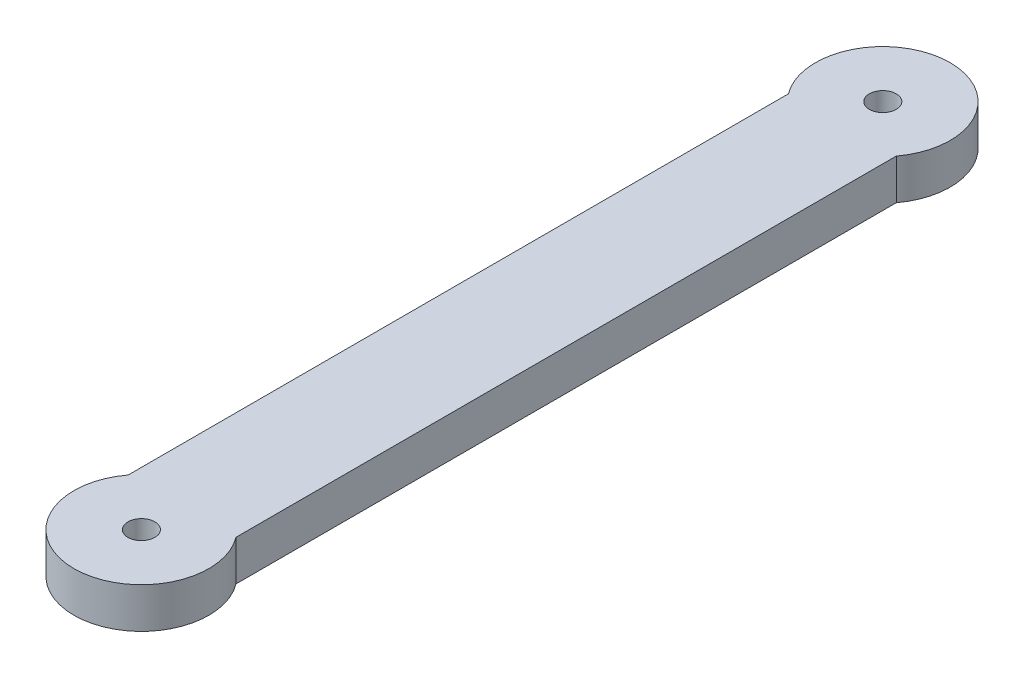
ISO-10303-21;
HEADER;
FILE_DESCRIPTION(('STEP AP214'),'2;1');
FILE_NAME('part.step','',(''),(''),'','','');
FILE_SCHEMA(('AUTOMOTIVE_DESIGN { 1 0 10303 214 1 1 1 1 }'));
ENDSEC;
DATA;
#1=APPLICATION_CONTEXT('core data for automotive mechanical design processes');
#2=APPLICATION_PROTOCOL_DEFINITION('international standard','automotive_design',2000,#1);
#3=PRODUCT_CONTEXT('',#1,'mechanical');
#4=PRODUCT('Part','Part','',(#3));
#5=PRODUCT_RELATED_PRODUCT_CATEGORY('part','',(#4));
#6=PRODUCT_DEFINITION_FORMATION('','',#4);
#7=PRODUCT_DEFINITION_CONTEXT('part definition',#1,'design');
#8=PRODUCT_DEFINITION('design','',#6,#7);
#9=PRODUCT_DEFINITION_SHAPE('','',#8);
#10=(LENGTH_UNIT() NAMED_UNIT(*) SI_UNIT(.MILLI.,.METRE.));
#11=(NAMED_UNIT(*) PLANE_ANGLE_UNIT() SI_UNIT($,.RADIAN.));
#12=(NAMED_UNIT(*) SI_UNIT($,.STERADIAN.) SOLID_ANGLE_UNIT());
#13=UNCERTAINTY_MEASURE_WITH_UNIT(LENGTH_MEASURE(1.E-05),#10,'distance_accuracy_value','');
#14=(GEOMETRIC_REPRESENTATION_CONTEXT(3) GLOBAL_UNCERTAINTY_ASSIGNED_CONTEXT((#13)) GLOBAL_UNIT_ASSIGNED_CONTEXT((#10,
#11,#12)) REPRESENTATION_CONTEXT('',''));
#15=CARTESIAN_POINT('',(0.,0.,0.));
#16=DIRECTION('',(0.,0.,1.));
#17=DIRECTION('',(1.,0.,0.));
#18=AXIS2_PLACEMENT_3D('',#15,#16,#17);
#19=CARTESIAN_POINT('',(0.,0.,-49.7448009401099));
#20=DIRECTION('',(0.,1.,0.));
#21=DIRECTION('',(1.,0.,0.));
#22=AXIS2_PLACEMENT_3D('',#19,#20,#21);
#23=PLANE('',#22);
#24=CARTESIAN_POINT('',(0.,0.,-22.250000257045));
#25=DIRECTION('',(0.,1.,0.));
#26=DIRECTION('',(1.,0.,0.));
#27=AXIS2_PLACEMENT_3D('',#24,#25,#26);
#28=CIRCLE('',#27,1.);
#29=CARTESIAN_POINT('',(-1.,0.,-22.250000257045));
#30=VERTEX_POINT('',#29);
#31=EDGE_CURVE('E95',#30,#30,#28,.T.);
#32=ORIENTED_EDGE('',*,*,#31,.T.);
#33=EDGE_LOOP('',(#32));
#34=FACE_BOUND('',#33,.T.);
#35=CARTESIAN_POINT('',(0.,0.,-77.250000257045));
#36=DIRECTION('',(0.,1.,0.));
#37=DIRECTION('',(1.,0.,0.));
#38=AXIS2_PLACEMENT_3D('',#35,#36,#37);
#39=CIRCLE('',#38,1.);
#40=CARTESIAN_POINT('',(-1.,0.,-77.250000257045));
#41=VERTEX_POINT('',#40);
#42=EDGE_CURVE('E115',#41,#41,#39,.T.);
#43=ORIENTED_EDGE('',*,*,#42,.T.);
#44=EDGE_LOOP('',(#43));
#45=FACE_BOUND('',#44,.T.);
#46=CARTESIAN_POINT('',(0.,0.,-22.250000257045));
#47=DIRECTION('',(0.,1.,0.));
#48=DIRECTION('',(-0.798339677558272,0.,-0.602207405497603));
#49=AXIS2_PLACEMENT_3D('',#46,#47,#48);
#50=CIRCLE('',#49,5.01039863387018);
#51=CARTESIAN_POINT('',(-4.00000002980232,0.,-25.2672994188567));
#52=VERTEX_POINT('',#51);
#53=CARTESIAN_POINT('',(4.00000002980232,0.,-25.2672994188567));
#54=VERTEX_POINT('',#53);
#55=EDGE_CURVE('E27',#52,#54,#50,.T.);
#56=ORIENTED_EDGE('',*,*,#55,.F.);
#57=DIRECTION('',(0.,0.,-1.));
#58=VECTOR('',#57,1.);
#59=CARTESIAN_POINT('',(-4.00000002980232,0.,-25.2672994188567));
#60=LINE('',#59,#58);
#61=CARTESIAN_POINT('',(-4.00000002980232,0.,-74.2500002967815));
#62=VERTEX_POINT('',#61);
#63=EDGE_CURVE('E117',#52,#62,#60,.T.);
#64=ORIENTED_EDGE('',*,*,#63,.T.);
#65=CARTESIAN_POINT('',(0.,0.,-77.250000257045));
#66=DIRECTION('',(0.,1.,0.));
#67=DIRECTION('',(0.800000005960464,0.,0.599999992052715));
#68=AXIS2_PLACEMENT_3D('',#65,#66,#67);
#69=CIRCLE('',#68,5.);
#70=CARTESIAN_POINT('',(4.00000002980232,0.,-74.2500002967815));
#71=VERTEX_POINT('',#70);
#72=EDGE_CURVE('E20',#71,#62,#69,.T.);
#73=ORIENTED_EDGE('',*,*,#72,.F.);
#74=DIRECTION('',(0.,0.,-1.));
#75=VECTOR('',#74,1.);
#76=CARTESIAN_POINT('',(4.00000002980232,0.,-25.2672994188567));
#77=LINE('',#76,#75);
#78=EDGE_CURVE('E55',#54,#71,#77,.T.);
#79=ORIENTED_EDGE('',*,*,#78,.F.);
#80=EDGE_LOOP('',(#56,#64,#73,#79));
#81=FACE_BOUND('',#80,.T.);
#82=ADVANCED_FACE('F16',(#34,#45,#81),#23,.F.);
#83=CARTESIAN_POINT('',(0.,3.,-49.7448009401099));
#84=DIRECTION('',(0.,1.,0.));
#85=DIRECTION('',(1.,0.,0.));
#86=AXIS2_PLACEMENT_3D('',#83,#84,#85);
#87=PLANE('',#86);
#88=CARTESIAN_POINT('',(0.,3.,-22.250000257045));
#89=DIRECTION('',(0.,-1.,0.));
#90=DIRECTION('',(1.,0.,0.));
#91=AXIS2_PLACEMENT_3D('',#88,#89,#90);
#92=CIRCLE('',#91,1.);
#93=CARTESIAN_POINT('',(-1.,3.,-22.250000257045));
#94=VERTEX_POINT('',#93);
#95=EDGE_CURVE('E111',#94,#94,#92,.T.);
#96=ORIENTED_EDGE('',*,*,#95,.T.);
#97=EDGE_LOOP('',(#96));
#98=FACE_BOUND('',#97,.T.);
#99=CARTESIAN_POINT('',(0.,3.,-77.250000257045));
#100=DIRECTION('',(0.,-1.,0.));
#101=DIRECTION('',(1.,0.,0.));
#102=AXIS2_PLACEMENT_3D('',#99,#100,#101);
#103=CIRCLE('',#102,1.);
#104=CARTESIAN_POINT('',(-1.,3.,-77.250000257045));
#105=VERTEX_POINT('',#104);
#106=EDGE_CURVE('E100',#105,#105,#103,.T.);
#107=ORIENTED_EDGE('',*,*,#106,.T.);
#108=EDGE_LOOP('',(#107));
#109=FACE_BOUND('',#108,.T.);
#110=CARTESIAN_POINT('',(0.,3.,-22.250000257045));
#111=DIRECTION('',(0.,1.,0.));
#112=DIRECTION('',(-0.798339677558272,0.,-0.602207405497603));
#113=AXIS2_PLACEMENT_3D('',#110,#111,#112);
#114=CIRCLE('',#113,5.01039863387018);
#115=CARTESIAN_POINT('',(-4.00000002980232,3.,-25.2672994188567));
#116=VERTEX_POINT('',#115);
#117=CARTESIAN_POINT('',(4.00000002980232,3.,-25.2672994188567));
#118=VERTEX_POINT('',#117);
#119=EDGE_CURVE('E11',#116,#118,#114,.T.);
#120=ORIENTED_EDGE('',*,*,#119,.T.);
#121=DIRECTION('',(0.,0.,-1.));
#122=VECTOR('',#121,1.);
#123=CARTESIAN_POINT('',(4.00000002980232,3.,-25.2672994188567));
#124=LINE('',#123,#122);
#125=CARTESIAN_POINT('',(4.00000002980232,3.,-74.2500002967815));
#126=VERTEX_POINT('',#125);
#127=EDGE_CURVE('E126',#118,#126,#124,.T.);
#128=ORIENTED_EDGE('',*,*,#127,.T.);
#129=CARTESIAN_POINT('',(0.,3.,-77.250000257045));
#130=DIRECTION('',(0.,1.,0.));
#131=DIRECTION('',(0.800000005960464,0.,0.599999992052715));
#132=AXIS2_PLACEMENT_3D('',#129,#130,#131);
#133=CIRCLE('',#132,5.);
#134=CARTESIAN_POINT('',(-4.00000002980232,3.,-74.2500002967815));
#135=VERTEX_POINT('',#134);
#136=EDGE_CURVE('E62',#126,#135,#133,.T.);
#137=ORIENTED_EDGE('',*,*,#136,.T.);
#138=DIRECTION('',(0.,0.,1.));
#139=VECTOR('',#138,1.);
#140=CARTESIAN_POINT('',(-4.00000002980232,3.,-25.2672994188567));
#141=LINE('',#140,#139);
#142=EDGE_CURVE('E119',#135,#116,#141,.T.);
#143=ORIENTED_EDGE('',*,*,#142,.T.);
#144=EDGE_LOOP('',(#120,#128,#137,#143));
#145=FACE_BOUND('',#144,.T.);
#146=ADVANCED_FACE('F154',(#98,#109,#145),#87,.T.);
#147=CARTESIAN_POINT('',(0.,0.,-22.250000257045));
#148=DIRECTION('',(0.,1.,0.));
#149=DIRECTION('',(0.,0.,1.));
#150=AXIS2_PLACEMENT_3D('',#147,#148,#149);
#151=CYLINDRICAL_SURFACE('',#150,5.01039863387018);
#152=ORIENTED_EDGE('',*,*,#55,.T.);
#153=DIRECTION('',(0.,1.,0.));
#154=VECTOR('',#153,1.);
#155=CARTESIAN_POINT('',(4.00000002980232,0.,-25.2672994188567));
#156=LINE('',#155,#154);
#157=EDGE_CURVE('E135',#54,#118,#156,.T.);
#158=ORIENTED_EDGE('',*,*,#157,.T.);
#159=ORIENTED_EDGE('',*,*,#119,.F.);
#160=DIRECTION('',(0.,1.,0.));
#161=VECTOR('',#160,1.);
#162=CARTESIAN_POINT('',(-4.00000002980232,0.,-25.2672994188567));
#163=LINE('',#162,#161);
#164=EDGE_CURVE('E123',#52,#116,#163,.T.);
#165=ORIENTED_EDGE('',*,*,#164,.F.);
#166=EDGE_LOOP('',(#152,#158,#159,#165));
#167=FACE_BOUND('',#166,.T.);
#168=ADVANCED_FACE('F156',(#167),#151,.T.);
#169=CARTESIAN_POINT('',(4.00000002980232,0.,-25.2672994188567));
#170=DIRECTION('',(1.,0.,0.));
#171=DIRECTION('',(0.,1.,0.));
#172=AXIS2_PLACEMENT_3D('',#169,#170,#171);
#173=PLANE('',#172);
#174=ORIENTED_EDGE('',*,*,#78,.T.);
#175=DIRECTION('',(0.,1.,0.));
#176=VECTOR('',#175,1.);
#177=CARTESIAN_POINT('',(4.00000002980232,0.,-74.2500002967815));
#178=LINE('',#177,#176);
#179=EDGE_CURVE('E127',#71,#126,#178,.T.);
#180=ORIENTED_EDGE('',*,*,#179,.T.);
#181=ORIENTED_EDGE('',*,*,#127,.F.);
#182=ORIENTED_EDGE('',*,*,#157,.F.);
#183=EDGE_LOOP('',(#174,#180,#181,#182));
#184=FACE_BOUND('',#183,.T.);
#185=ADVANCED_FACE('F165',(#184),#173,.T.);
#186=CARTESIAN_POINT('',(0.,0.,-77.250000257045));
#187=DIRECTION('',(0.,1.,0.));
#188=DIRECTION('',(0.,0.,-1.));
#189=AXIS2_PLACEMENT_3D('',#186,#187,#188);
#190=CYLINDRICAL_SURFACE('',#189,5.);
#191=ORIENTED_EDGE('',*,*,#72,.T.);
#192=DIRECTION('',(0.,1.,0.));
#193=VECTOR('',#192,1.);
#194=CARTESIAN_POINT('',(-4.00000002980232,0.,-74.2500002967815));
#195=LINE('',#194,#193);
#196=EDGE_CURVE('E122',#62,#135,#195,.T.);
#197=ORIENTED_EDGE('',*,*,#196,.T.);
#198=ORIENTED_EDGE('',*,*,#136,.F.);
#199=ORIENTED_EDGE('',*,*,#179,.F.);
#200=EDGE_LOOP('',(#191,#197,#198,#199));
#201=FACE_BOUND('',#200,.T.);
#202=ADVANCED_FACE('F174',(#201),#190,.T.);
#203=CARTESIAN_POINT('',(-4.00000002980232,0.,-74.2500002967815));
#204=DIRECTION('',(-1.,0.,0.));
#205=DIRECTION('',(0.,0.,1.));
#206=AXIS2_PLACEMENT_3D('',#203,#204,#205);
#207=PLANE('',#206);
#208=ORIENTED_EDGE('',*,*,#63,.F.);
#209=ORIENTED_EDGE('',*,*,#164,.T.);
#210=ORIENTED_EDGE('',*,*,#142,.F.);
#211=ORIENTED_EDGE('',*,*,#196,.F.);
#212=EDGE_LOOP('',(#208,#209,#210,#211));
#213=FACE_BOUND('',#212,.T.);
#214=ADVANCED_FACE('F18',(#213),#207,.T.);
#215=CARTESIAN_POINT('',(0.,0.,-77.250000257045));
#216=DIRECTION('',(0.,1.,0.));
#217=DIRECTION('',(1.,0.,0.));
#218=AXIS2_PLACEMENT_3D('',#215,#216,#217);
#219=CYLINDRICAL_SURFACE('',#218,1.);
#220=ORIENTED_EDGE('',*,*,#106,.F.);
#221=DIRECTION('',(0.,-1.,0.));
#222=VECTOR('',#221,1.);
#223=CARTESIAN_POINT('',(-1.,0.,-77.250000257045));
#224=LINE('',#223,#222);
#225=EDGE_CURVE('E109',#105,#41,#224,.T.);
#226=ORIENTED_EDGE('',*,*,#225,.T.);
#227=ORIENTED_EDGE('',*,*,#42,.F.);
#228=ORIENTED_EDGE('',*,*,#225,.F.);
#229=EDGE_LOOP('',(#220,#226,#227,#228));
#230=FACE_BOUND('',#229,.T.);
#231=ADVANCED_FACE('F152',(#230),#219,.F.);
#232=CARTESIAN_POINT('',(0.,0.,-22.250000257045));
#233=DIRECTION('',(0.,1.,0.));
#234=DIRECTION('',(1.,0.,0.));
#235=AXIS2_PLACEMENT_3D('',#232,#233,#234);
#236=CYLINDRICAL_SURFACE('',#235,1.);
#237=ORIENTED_EDGE('',*,*,#95,.F.);
#238=DIRECTION('',(0.,-1.,0.));
#239=VECTOR('',#238,1.);
#240=CARTESIAN_POINT('',(-1.,0.,-22.250000257045));
#241=LINE('',#240,#239);
#242=EDGE_CURVE('E101',#94,#30,#241,.T.);
#243=ORIENTED_EDGE('',*,*,#242,.T.);
#244=ORIENTED_EDGE('',*,*,#31,.F.);
#245=ORIENTED_EDGE('',*,*,#242,.F.);
#246=EDGE_LOOP('',(#237,#243,#244,#245));
#247=FACE_BOUND('',#246,.T.);
#248=ADVANCED_FACE('F170',(#247),#236,.F.);
#249=CLOSED_SHELL('',(#82,#146,#168,#185,#202,#214,#231,#248));
#250=MANIFOLD_SOLID_BREP('B1',#249);
#251=ADVANCED_BREP_SHAPE_REPRESENTATION('',(#18,#250),#14);
#252=SHAPE_DEFINITION_REPRESENTATION(#9,#251);
ENDSEC;
END-ISO-10303-21;
